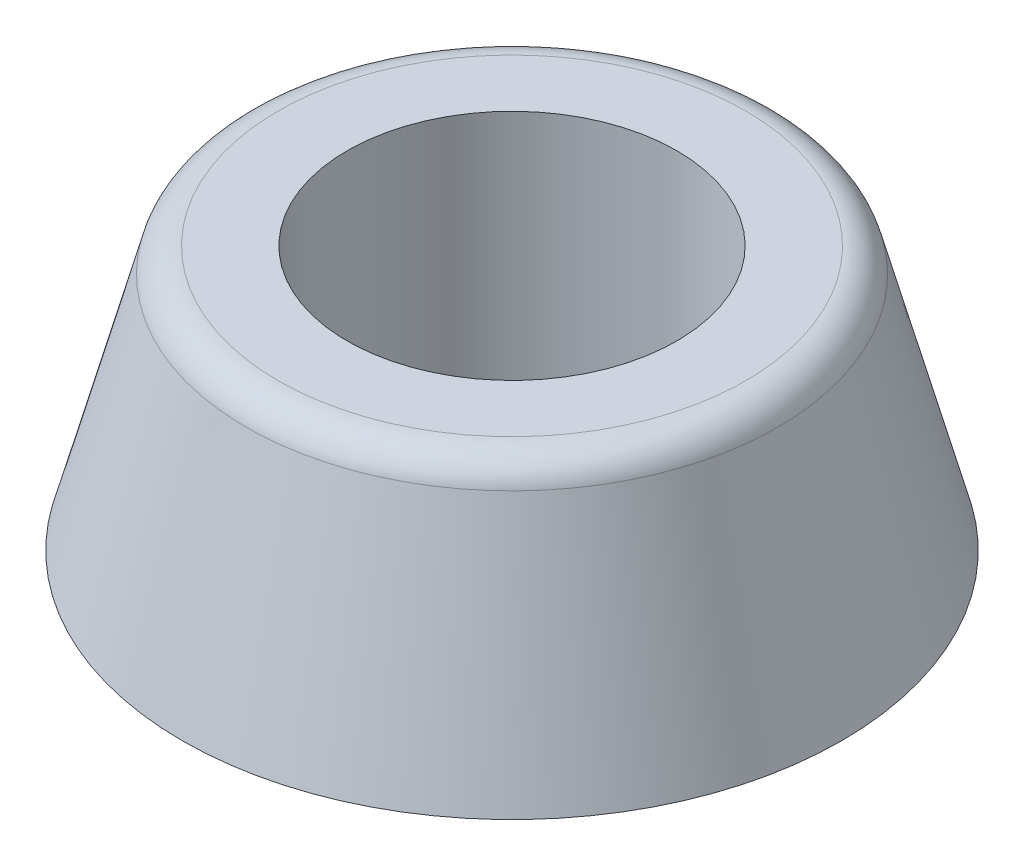
ISO-10303-21;
HEADER;
FILE_DESCRIPTION(('STEP AP214'),'2;1');
FILE_NAME('part.step','',(''),(''),'','','');
FILE_SCHEMA(('AUTOMOTIVE_DESIGN { 1 0 10303 214 1 1 1 1 }'));
ENDSEC;
DATA;
#1=APPLICATION_CONTEXT('core data for automotive mechanical design processes');
#2=APPLICATION_PROTOCOL_DEFINITION('international standard','automotive_design',2000,#1);
#3=PRODUCT_CONTEXT('',#1,'mechanical');
#4=PRODUCT('Part','Part','',(#3));
#5=PRODUCT_RELATED_PRODUCT_CATEGORY('part','',(#4));
#6=PRODUCT_DEFINITION_FORMATION('','',#4);
#7=PRODUCT_DEFINITION_CONTEXT('part definition',#1,'design');
#8=PRODUCT_DEFINITION('design','',#6,#7);
#9=PRODUCT_DEFINITION_SHAPE('','',#8);
#10=(LENGTH_UNIT() NAMED_UNIT(*) SI_UNIT(.MILLI.,.METRE.));
#11=(NAMED_UNIT(*) PLANE_ANGLE_UNIT() SI_UNIT($,.RADIAN.));
#12=(NAMED_UNIT(*) SI_UNIT($,.STERADIAN.) SOLID_ANGLE_UNIT());
#13=UNCERTAINTY_MEASURE_WITH_UNIT(LENGTH_MEASURE(1.E-05),#10,'distance_accuracy_value','');
#14=(GEOMETRIC_REPRESENTATION_CONTEXT(3) GLOBAL_UNCERTAINTY_ASSIGNED_CONTEXT((#13)) GLOBAL_UNIT_ASSIGNED_CONTEXT((#10,
#11,#12)) REPRESENTATION_CONTEXT('',''));
#15=CARTESIAN_POINT('',(0.,0.,0.));
#16=DIRECTION('',(0.,0.,1.));
#17=DIRECTION('',(1.,0.,0.));
#18=AXIS2_PLACEMENT_3D('',#15,#16,#17);
#19=CARTESIAN_POINT('',(0.,4.,0.));
#20=DIRECTION('',(0.,-1.,0.));
#21=DIRECTION('',(0.,0.,-1.));
#22=AXIS2_PLACEMENT_3D('',#19,#20,#21);
#23=CONICAL_SURFACE('',#22,10.,0.261799387799154);
#24=CARTESIAN_POINT('',(0.,11.2588190451025,0.));
#25=DIRECTION('',(0.,-1.,0.));
#26=DIRECTION('',(0.,0.,-1.));
#27=AXIS2_PLACEMENT_3D('',#24,#25,#26);
#28=CIRCLE('',#27,8.05500529886109);
#29=CARTESIAN_POINT('',(0.,11.2588190451025,-8.05500529886109));
#30=VERTEX_POINT('',#29);
#31=EDGE_CURVE('E52',#30,#30,#28,.T.);
#32=ORIENTED_EDGE('',*,*,#31,.T.);
#33=EDGE_LOOP('',(#32));
#34=FACE_BOUND('',#33,.T.);
#35=CARTESIAN_POINT('',(0.,4.,0.));
#36=DIRECTION('',(0.,-1.,0.));
#37=DIRECTION('',(0.,0.,-1.));
#38=AXIS2_PLACEMENT_3D('',#35,#36,#37);
#39=CIRCLE('',#38,10.);
#40=CARTESIAN_POINT('',(0.,4.,-10.));
#41=VERTEX_POINT('',#40);
#42=EDGE_CURVE('E10',#41,#41,#39,.T.);
#43=ORIENTED_EDGE('',*,*,#42,.F.);
#44=EDGE_LOOP('',(#43));
#45=FACE_BOUND('',#44,.T.);
#46=ADVANCED_FACE('F33',(#34,#45),#23,.T.);
#47=CARTESIAN_POINT('',(5.,4.,0.));
#48=DIRECTION('',(0.,-1.,0.));
#49=DIRECTION('',(0.,0.,-1.));
#50=AXIS2_PLACEMENT_3D('',#47,#48,#49);
#51=PLANE('',#50);
#52=ORIENTED_EDGE('',*,*,#42,.T.);
#53=EDGE_LOOP('',(#52));
#54=FACE_BOUND('',#53,.T.);
#55=CARTESIAN_POINT('',(0.,4.,0.));
#56=DIRECTION('',(0.,-1.,0.));
#57=DIRECTION('',(0.,0.,-1.));
#58=AXIS2_PLACEMENT_3D('',#55,#56,#57);
#59=CIRCLE('',#58,5.);
#60=CARTESIAN_POINT('',(0.,4.,-5.));
#61=VERTEX_POINT('',#60);
#62=EDGE_CURVE('E39',#61,#61,#59,.T.);
#63=ORIENTED_EDGE('',*,*,#62,.F.);
#64=EDGE_LOOP('',(#63));
#65=FACE_BOUND('',#64,.T.);
#66=ADVANCED_FACE('F70',(#54,#65),#51,.T.);
#67=CARTESIAN_POINT('',(0.,-21.8656979304271,0.));
#68=DIRECTION('',(0.,-1.,0.));
#69=DIRECTION('',(0.,0.,-1.));
#70=AXIS2_PLACEMENT_3D('',#67,#68,#69);
#71=CYLINDRICAL_SURFACE('',#70,5.);
#72=ORIENTED_EDGE('',*,*,#62,.T.);
#73=EDGE_LOOP('',(#72));
#74=FACE_BOUND('',#73,.T.);
#75=CARTESIAN_POINT('',(0.,12.,0.));
#76=DIRECTION('',(0.,-1.,0.));
#77=DIRECTION('',(0.,0.,-1.));
#78=AXIS2_PLACEMENT_3D('',#75,#76,#77);
#79=CIRCLE('',#78,5.);
#80=CARTESIAN_POINT('',(0.,12.,-5.));
#81=VERTEX_POINT('',#80);
#82=EDGE_CURVE('E43',#81,#81,#79,.T.);
#83=ORIENTED_EDGE('',*,*,#82,.F.);
#84=EDGE_LOOP('',(#83));
#85=FACE_BOUND('',#84,.T.);
#86=ADVANCED_FACE('F66',(#74,#85),#71,.F.);
#87=CARTESIAN_POINT('',(7.08907947257202,12.,0.));
#88=DIRECTION('',(0.,1.,0.));
#89=DIRECTION('',(0.,0.,1.));
#90=AXIS2_PLACEMENT_3D('',#87,#88,#89);
#91=PLANE('',#90);
#92=ORIENTED_EDGE('',*,*,#82,.T.);
#93=EDGE_LOOP('',(#92));
#94=FACE_BOUND('',#93,.T.);
#95=CARTESIAN_POINT('',(0.,12.,0.));
#96=DIRECTION('',(0.,-1.,0.));
#97=DIRECTION('',(0.,0.,-1.));
#98=AXIS2_PLACEMENT_3D('',#95,#96,#97);
#99=CIRCLE('',#98,7.08907947257202);
#100=CARTESIAN_POINT('',(0.,12.,-7.08907947257202));
#101=VERTEX_POINT('',#100);
#102=EDGE_CURVE('E47',#101,#101,#99,.T.);
#103=ORIENTED_EDGE('',*,*,#102,.F.);
#104=EDGE_LOOP('',(#103));
#105=FACE_BOUND('',#104,.T.);
#106=ADVANCED_FACE('F60',(#94,#105),#91,.T.);
#107=CARTESIAN_POINT('',(0.,11.,0.));
#108=DIRECTION('',(0.,-1.,0.));
#109=DIRECTION('',(0.,0.,-1.));
#110=AXIS2_PLACEMENT_3D('',#107,#108,#109);
#111=TOROIDAL_SURFACE('',#110,7.08907947257202,0.999999999999999);
#112=ORIENTED_EDGE('',*,*,#102,.T.);
#113=EDGE_LOOP('',(#112));
#114=FACE_BOUND('',#113,.T.);
#115=ORIENTED_EDGE('',*,*,#31,.F.);
#116=EDGE_LOOP('',(#115));
#117=FACE_BOUND('',#116,.T.);
#118=ADVANCED_FACE('F58',(#114,#117),#111,.T.);
#119=CLOSED_SHELL('',(#46,#66,#86,#106,#118));
#120=MANIFOLD_SOLID_BREP('B2',#119);
#121=ADVANCED_BREP_SHAPE_REPRESENTATION('',(#18,#120),#14);
#122=SHAPE_DEFINITION_REPRESENTATION(#9,#121);
ENDSEC;
END-ISO-10303-21;
